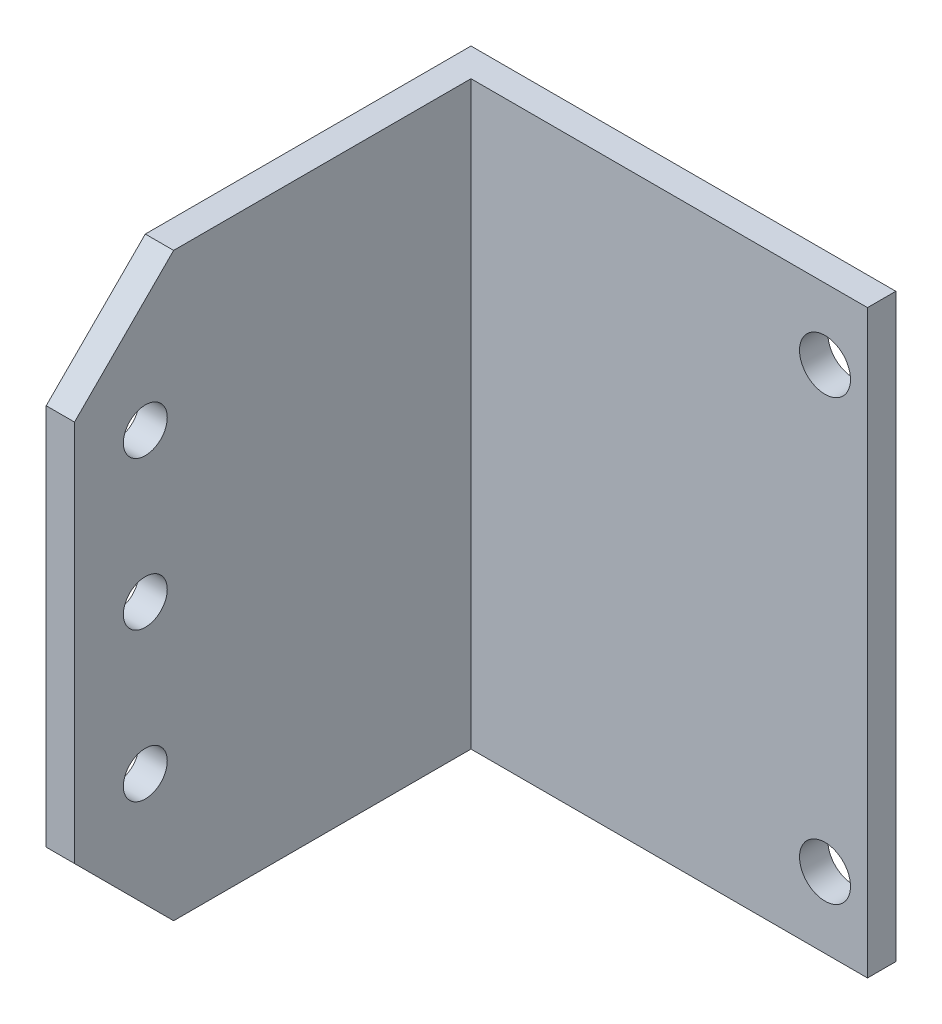
ISO-10303-21;
HEADER;
FILE_DESCRIPTION(('STEP AP214'),'2;1');
FILE_NAME('part.step','',(''),(''),'','','');
FILE_SCHEMA(('AUTOMOTIVE_DESIGN { 1 0 10303 214 1 1 1 1 }'));
ENDSEC;
DATA;
#1=APPLICATION_CONTEXT('core data for automotive mechanical design processes');
#2=APPLICATION_PROTOCOL_DEFINITION('international standard','automotive_design',2000,#1);
#3=PRODUCT_CONTEXT('',#1,'mechanical');
#4=PRODUCT('Part','Part','',(#3));
#5=PRODUCT_RELATED_PRODUCT_CATEGORY('part','',(#4));
#6=PRODUCT_DEFINITION_FORMATION('','',#4);
#7=PRODUCT_DEFINITION_CONTEXT('part definition',#1,'design');
#8=PRODUCT_DEFINITION('design','',#6,#7);
#9=PRODUCT_DEFINITION_SHAPE('','',#8);
#10=(LENGTH_UNIT() NAMED_UNIT(*) SI_UNIT(.MILLI.,.METRE.));
#11=(NAMED_UNIT(*) PLANE_ANGLE_UNIT() SI_UNIT($,.RADIAN.));
#12=(NAMED_UNIT(*) SI_UNIT($,.STERADIAN.) SOLID_ANGLE_UNIT());
#13=UNCERTAINTY_MEASURE_WITH_UNIT(LENGTH_MEASURE(1.E-05),#10,'distance_accuracy_value','');
#14=(GEOMETRIC_REPRESENTATION_CONTEXT(3) GLOBAL_UNCERTAINTY_ASSIGNED_CONTEXT((#13)) GLOBAL_UNIT_ASSIGNED_CONTEXT((#10,
#11,#12)) REPRESENTATION_CONTEXT('',''));
#15=CARTESIAN_POINT('',(0.,0.,0.));
#16=DIRECTION('',(0.,0.,1.));
#17=DIRECTION('',(1.,0.,0.));
#18=AXIS2_PLACEMENT_3D('',#15,#16,#17);
#19=CARTESIAN_POINT('',(0.,0.,2.));
#20=DIRECTION('',(0.,0.,-1.));
#21=DIRECTION('',(-1.,0.,0.));
#22=AXIS2_PLACEMENT_3D('',#19,#20,#21);
#23=PLANE('',#22);
#24=CARTESIAN_POINT('',(-3.,-15.5,2.));
#25=DIRECTION('',(0.,0.,1.));
#26=DIRECTION('',(1.,0.,0.));
#27=AXIS2_PLACEMENT_3D('',#24,#25,#26);
#28=CIRCLE('',#27,1.79999999999998);
#29=CARTESIAN_POINT('',(-1.20000000000001,-15.5,2.));
#30=VERTEX_POINT('',#29);
#31=EDGE_CURVE('E120',#30,#30,#28,.T.);
#32=ORIENTED_EDGE('',*,*,#31,.F.);
#33=EDGE_LOOP('',(#32));
#34=FACE_BOUND('',#33,.T.);
#35=CARTESIAN_POINT('',(-2.99999999999999,15.5,2.));
#36=DIRECTION('',(0.,0.,1.));
#37=DIRECTION('',(1.,0.,0.));
#38=AXIS2_PLACEMENT_3D('',#35,#36,#37);
#39=CIRCLE('',#38,1.79999999999998);
#40=CARTESIAN_POINT('',(-1.20000000000001,15.5,2.));
#41=VERTEX_POINT('',#40);
#42=EDGE_CURVE('E145',#41,#41,#39,.T.);
#43=ORIENTED_EDGE('',*,*,#42,.F.);
#44=EDGE_LOOP('',(#43));
#45=FACE_BOUND('',#44,.T.);
#46=DIRECTION('',(0.,1.,0.));
#47=VECTOR('',#46,1.);
#48=CARTESIAN_POINT('',(-28.,-20.5,2.));
#49=LINE('',#48,#47);
#50=CARTESIAN_POINT('',(-28.,-20.5,2.));
#51=VERTEX_POINT('',#50);
#52=CARTESIAN_POINT('',(-28.,20.5,2.));
#53=VERTEX_POINT('',#52);
#54=EDGE_CURVE('E133',#51,#53,#49,.T.);
#55=ORIENTED_EDGE('',*,*,#54,.F.);
#56=DIRECTION('',(1.,0.,0.));
#57=VECTOR('',#56,1.);
#58=CARTESIAN_POINT('',(0.,-20.5,2.));
#59=LINE('',#58,#57);
#60=CARTESIAN_POINT('',(0.,-20.5,2.));
#61=VERTEX_POINT('',#60);
#62=EDGE_CURVE('E116',#51,#61,#59,.T.);
#63=ORIENTED_EDGE('',*,*,#62,.T.);
#64=DIRECTION('',(0.,1.,0.));
#65=VECTOR('',#64,1.);
#66=CARTESIAN_POINT('',(0.,20.5,2.));
#67=LINE('',#66,#65);
#68=CARTESIAN_POINT('',(0.,20.5,2.));
#69=VERTEX_POINT('',#68);
#70=EDGE_CURVE('E151',#61,#69,#67,.T.);
#71=ORIENTED_EDGE('',*,*,#70,.T.);
#72=DIRECTION('',(-1.,0.,0.));
#73=VECTOR('',#72,1.);
#74=CARTESIAN_POINT('',(0.,20.5,2.));
#75=LINE('',#74,#73);
#76=EDGE_CURVE('E154',#69,#53,#75,.T.);
#77=ORIENTED_EDGE('',*,*,#76,.T.);
#78=EDGE_LOOP('',(#55,#63,#71,#77));
#79=FACE_BOUND('',#78,.T.);
#80=ADVANCED_FACE('F32',(#34,#45,#79),#23,.F.);
#81=CARTESIAN_POINT('',(0.,0.,0.));
#82=DIRECTION('',(0.,0.,-1.));
#83=DIRECTION('',(-1.,0.,0.));
#84=AXIS2_PLACEMENT_3D('',#81,#82,#83);
#85=PLANE('',#84);
#86=CARTESIAN_POINT('',(-2.99999999999999,15.5,0.));
#87=DIRECTION('',(0.,0.,1.));
#88=DIRECTION('',(1.,0.,0.));
#89=AXIS2_PLACEMENT_3D('',#86,#87,#88);
#90=CIRCLE('',#89,1.79999999999998);
#91=CARTESIAN_POINT('',(-1.20000000000001,15.5,0.));
#92=VERTEX_POINT('',#91);
#93=EDGE_CURVE('E143',#92,#92,#90,.T.);
#94=ORIENTED_EDGE('',*,*,#93,.T.);
#95=EDGE_LOOP('',(#94));
#96=FACE_BOUND('',#95,.T.);
#97=DIRECTION('',(0.,1.,0.));
#98=VECTOR('',#97,1.);
#99=CARTESIAN_POINT('',(0.,20.5,0.));
#100=LINE('',#99,#98);
#101=CARTESIAN_POINT('',(0.,-20.5,0.));
#102=VERTEX_POINT('',#101);
#103=CARTESIAN_POINT('',(0.,20.5,0.));
#104=VERTEX_POINT('',#103);
#105=EDGE_CURVE('E148',#102,#104,#100,.T.);
#106=ORIENTED_EDGE('',*,*,#105,.F.);
#107=DIRECTION('',(1.,0.,0.));
#108=VECTOR('',#107,1.);
#109=CARTESIAN_POINT('',(0.,-20.5,0.));
#110=LINE('',#109,#108);
#111=CARTESIAN_POINT('',(-30.,-20.5,0.));
#112=VERTEX_POINT('',#111);
#113=EDGE_CURVE('E155',#112,#102,#110,.T.);
#114=ORIENTED_EDGE('',*,*,#113,.F.);
#115=DIRECTION('',(0.,-1.,0.));
#116=VECTOR('',#115,1.);
#117=CARTESIAN_POINT('',(-30.,20.5,0.));
#118=LINE('',#117,#116);
#119=CARTESIAN_POINT('',(-30.,20.5,0.));
#120=VERTEX_POINT('',#119);
#121=EDGE_CURVE('E171',#120,#112,#118,.T.);
#122=ORIENTED_EDGE('',*,*,#121,.F.);
#123=DIRECTION('',(-1.,0.,0.));
#124=VECTOR('',#123,1.);
#125=CARTESIAN_POINT('',(0.,20.5,0.));
#126=LINE('',#125,#124);
#127=EDGE_CURVE('E174',#104,#120,#126,.T.);
#128=ORIENTED_EDGE('',*,*,#127,.F.);
#129=EDGE_LOOP('',(#106,#114,#122,#128));
#130=FACE_BOUND('',#129,.T.);
#131=CARTESIAN_POINT('',(-3.,-15.5,0.));
#132=DIRECTION('',(0.,0.,1.));
#133=DIRECTION('',(1.,0.,0.));
#134=AXIS2_PLACEMENT_3D('',#131,#132,#133);
#135=CIRCLE('',#134,1.79999999999998);
#136=CARTESIAN_POINT('',(-1.20000000000001,-15.5,0.));
#137=VERTEX_POINT('',#136);
#138=EDGE_CURVE('E117',#137,#137,#135,.T.);
#139=ORIENTED_EDGE('',*,*,#138,.T.);
#140=EDGE_LOOP('',(#139));
#141=FACE_BOUND('',#140,.T.);
#142=ADVANCED_FACE('F183',(#96,#130,#141),#85,.T.);
#143=CARTESIAN_POINT('',(0.,20.5,2.));
#144=DIRECTION('',(-1.,0.,0.));
#145=DIRECTION('',(0.,-1.,0.));
#146=AXIS2_PLACEMENT_3D('',#143,#144,#145);
#147=PLANE('',#146);
#148=ORIENTED_EDGE('',*,*,#105,.T.);
#149=DIRECTION('',(0.,0.,-1.));
#150=VECTOR('',#149,1.);
#151=CARTESIAN_POINT('',(0.,20.5,2.));
#152=LINE('',#151,#150);
#153=EDGE_CURVE('E160',#69,#104,#152,.T.);
#154=ORIENTED_EDGE('',*,*,#153,.F.);
#155=ORIENTED_EDGE('',*,*,#70,.F.);
#156=DIRECTION('',(0.,0.,-1.));
#157=VECTOR('',#156,1.);
#158=CARTESIAN_POINT('',(0.,-20.5,2.));
#159=LINE('',#158,#157);
#160=EDGE_CURVE('E167',#61,#102,#159,.T.);
#161=ORIENTED_EDGE('',*,*,#160,.T.);
#162=EDGE_LOOP('',(#148,#154,#155,#161));
#163=FACE_BOUND('',#162,.T.);
#164=ADVANCED_FACE('F34',(#163),#147,.F.);
#165=CARTESIAN_POINT('',(0.,20.5,2.));
#166=DIRECTION('',(0.,-1.,0.));
#167=DIRECTION('',(0.,0.,-1.));
#168=AXIS2_PLACEMENT_3D('',#165,#166,#167);
#169=PLANE('',#168);
#170=DIRECTION('',(0.,0.,-1.));
#171=VECTOR('',#170,1.);
#172=CARTESIAN_POINT('',(-30.,20.5,2.));
#173=LINE('',#172,#171);
#174=CARTESIAN_POINT('',(-30.,20.5,23.));
#175=VERTEX_POINT('',#174);
#176=EDGE_CURVE('E163',#175,#120,#173,.T.);
#177=ORIENTED_EDGE('',*,*,#176,.F.);
#178=DIRECTION('',(1.,0.,0.));
#179=VECTOR('',#178,1.);
#180=CARTESIAN_POINT('',(-38.,20.5,23.));
#181=LINE('',#180,#179);
#182=CARTESIAN_POINT('',(-28.,20.5,23.));
#183=VERTEX_POINT('',#182);
#184=EDGE_CURVE('E192',#175,#183,#181,.T.);
#185=ORIENTED_EDGE('',*,*,#184,.T.);
#186=DIRECTION('',(0.,0.,-1.));
#187=VECTOR('',#186,1.);
#188=CARTESIAN_POINT('',(-28.,20.5,30.));
#189=LINE('',#188,#187);
#190=EDGE_CURVE('E118',#183,#53,#189,.T.);
#191=ORIENTED_EDGE('',*,*,#190,.T.);
#192=ORIENTED_EDGE('',*,*,#76,.F.);
#193=ORIENTED_EDGE('',*,*,#153,.T.);
#194=ORIENTED_EDGE('',*,*,#127,.T.);
#195=EDGE_LOOP('',(#177,#185,#191,#192,#193,#194));
#196=FACE_BOUND('',#195,.T.);
#197=ADVANCED_FACE('F187',(#196),#169,.F.);
#198=CARTESIAN_POINT('',(-30.,20.5,2.));
#199=DIRECTION('',(1.,0.,0.));
#200=DIRECTION('',(0.,0.,-1.));
#201=AXIS2_PLACEMENT_3D('',#198,#199,#200);
#202=PLANE('',#201);
#203=CARTESIAN_POINT('',(-30.,0.,25.));
#204=DIRECTION('',(1.,0.,0.));
#205=DIRECTION('',(0.,0.,-1.));
#206=AXIS2_PLACEMENT_3D('',#203,#204,#205);
#207=CIRCLE('',#206,1.55);
#208=CARTESIAN_POINT('',(-30.,0.,23.45));
#209=VERTEX_POINT('',#208);
#210=EDGE_CURVE('E208',#209,#209,#207,.T.);
#211=ORIENTED_EDGE('',*,*,#210,.T.);
#212=EDGE_LOOP('',(#211));
#213=FACE_BOUND('',#212,.T.);
#214=CARTESIAN_POINT('',(-30.,-10.5,25.));
#215=DIRECTION('',(1.,0.,0.));
#216=DIRECTION('',(0.,0.,-1.));
#217=AXIS2_PLACEMENT_3D('',#214,#215,#216);
#218=CIRCLE('',#217,1.55);
#219=CARTESIAN_POINT('',(-30.,-10.5,23.45));
#220=VERTEX_POINT('',#219);
#221=EDGE_CURVE('E216',#220,#220,#218,.T.);
#222=ORIENTED_EDGE('',*,*,#221,.T.);
#223=EDGE_LOOP('',(#222));
#224=FACE_BOUND('',#223,.T.);
#225=CARTESIAN_POINT('',(-30.,10.5,25.));
#226=DIRECTION('',(1.,0.,0.));
#227=DIRECTION('',(0.,0.,-1.));
#228=AXIS2_PLACEMENT_3D('',#225,#226,#227);
#229=CIRCLE('',#228,1.55);
#230=CARTESIAN_POINT('',(-30.,10.5,23.45));
#231=VERTEX_POINT('',#230);
#232=EDGE_CURVE('E195',#231,#231,#229,.T.);
#233=ORIENTED_EDGE('',*,*,#232,.T.);
#234=EDGE_LOOP('',(#233));
#235=FACE_BOUND('',#234,.T.);
#236=DIRECTION('',(0.,0.,-1.));
#237=VECTOR('',#236,1.);
#238=CARTESIAN_POINT('',(-30.,-20.5,2.));
#239=LINE('',#238,#237);
#240=CARTESIAN_POINT('',(-30.,-20.5,23.));
#241=VERTEX_POINT('',#240);
#242=EDGE_CURVE('E165',#241,#112,#239,.T.);
#243=ORIENTED_EDGE('',*,*,#242,.F.);
#244=DIRECTION('',(0.,0.707106781186548,0.707106781186548));
#245=VECTOR('',#244,1.);
#246=CARTESIAN_POINT('',(-30.,-10.5,33.));
#247=LINE('',#246,#245);
#248=CARTESIAN_POINT('',(-30.,-13.5,30.));
#249=VERTEX_POINT('',#248);
#250=EDGE_CURVE('E100',#241,#249,#247,.T.);
#251=ORIENTED_EDGE('',*,*,#250,.T.);
#252=DIRECTION('',(0.,-1.,0.));
#253=VECTOR('',#252,1.);
#254=CARTESIAN_POINT('',(-30.,-20.5,30.));
#255=LINE('',#254,#253);
#256=CARTESIAN_POINT('',(-30.,13.5,30.));
#257=VERTEX_POINT('',#256);
#258=EDGE_CURVE('E127',#257,#249,#255,.T.);
#259=ORIENTED_EDGE('',*,*,#258,.F.);
#260=DIRECTION('',(0.,0.707106781186548,-0.707106781186548));
#261=VECTOR('',#260,1.);
#262=CARTESIAN_POINT('',(-30.,31.,12.5));
#263=LINE('',#262,#261);
#264=EDGE_CURVE('E56',#257,#175,#263,.T.);
#265=ORIENTED_EDGE('',*,*,#264,.T.);
#266=ORIENTED_EDGE('',*,*,#176,.T.);
#267=ORIENTED_EDGE('',*,*,#121,.T.);
#268=EDGE_LOOP('',(#243,#251,#259,#265,#266,#267));
#269=FACE_BOUND('',#268,.T.);
#270=ADVANCED_FACE('F190',(#213,#224,#235,#269),#202,.F.);
#271=CARTESIAN_POINT('',(0.,-20.5,2.));
#272=DIRECTION('',(0.,1.,0.));
#273=DIRECTION('',(-1.,0.,0.));
#274=AXIS2_PLACEMENT_3D('',#271,#272,#273);
#275=PLANE('',#274);
#276=DIRECTION('',(0.,0.,-1.));
#277=VECTOR('',#276,1.);
#278=CARTESIAN_POINT('',(-28.,-20.5,30.));
#279=LINE('',#278,#277);
#280=CARTESIAN_POINT('',(-28.,-20.5,23.));
#281=VERTEX_POINT('',#280);
#282=EDGE_CURVE('E36',#281,#51,#279,.T.);
#283=ORIENTED_EDGE('',*,*,#282,.F.);
#284=DIRECTION('',(1.,0.,0.));
#285=VECTOR('',#284,1.);
#286=CARTESIAN_POINT('',(-38.,-20.5,23.));
#287=LINE('',#286,#285);
#288=EDGE_CURVE('E97',#241,#281,#287,.T.);
#289=ORIENTED_EDGE('',*,*,#288,.F.);
#290=ORIENTED_EDGE('',*,*,#242,.T.);
#291=ORIENTED_EDGE('',*,*,#113,.T.);
#292=ORIENTED_EDGE('',*,*,#160,.F.);
#293=ORIENTED_EDGE('',*,*,#62,.F.);
#294=EDGE_LOOP('',(#283,#289,#290,#291,#292,#293));
#295=FACE_BOUND('',#294,.T.);
#296=ADVANCED_FACE('F114',(#295),#275,.F.);
#297=CARTESIAN_POINT('',(-2.99999999999999,15.5,2.));
#298=DIRECTION('',(0.,0.,-1.));
#299=DIRECTION('',(-1.,0.,0.));
#300=AXIS2_PLACEMENT_3D('',#297,#298,#299);
#301=CYLINDRICAL_SURFACE('',#300,1.79999999999998);
#302=ORIENTED_EDGE('',*,*,#42,.T.);
#303=EDGE_LOOP('',(#302));
#304=FACE_BOUND('',#303,.T.);
#305=ORIENTED_EDGE('',*,*,#93,.F.);
#306=EDGE_LOOP('',(#305));
#307=FACE_BOUND('',#306,.T.);
#308=ADVANCED_FACE('F234',(#304,#307),#301,.F.);
#309=CARTESIAN_POINT('',(-3.,-15.5,2.));
#310=DIRECTION('',(0.,0.,-1.));
#311=DIRECTION('',(-1.,0.,0.));
#312=AXIS2_PLACEMENT_3D('',#309,#310,#311);
#313=CYLINDRICAL_SURFACE('',#312,1.79999999999998);
#314=ORIENTED_EDGE('',*,*,#31,.T.);
#315=EDGE_LOOP('',(#314));
#316=FACE_BOUND('',#315,.T.);
#317=ORIENTED_EDGE('',*,*,#138,.F.);
#318=EDGE_LOOP('',(#317));
#319=FACE_BOUND('',#318,.T.);
#320=ADVANCED_FACE('F225',(#316,#319),#313,.F.);
#321=CARTESIAN_POINT('',(-28.,-20.5,30.));
#322=DIRECTION('',(-1.,0.,0.));
#323=DIRECTION('',(0.,0.,1.));
#324=AXIS2_PLACEMENT_3D('',#321,#322,#323);
#325=PLANE('',#324);
#326=CARTESIAN_POINT('',(-28.,0.,25.));
#327=DIRECTION('',(1.,0.,0.));
#328=DIRECTION('',(0.,0.,-1.));
#329=AXIS2_PLACEMENT_3D('',#326,#327,#328);
#330=CIRCLE('',#329,1.55);
#331=CARTESIAN_POINT('',(-28.,0.,23.45));
#332=VERTEX_POINT('',#331);
#333=EDGE_CURVE('E205',#332,#332,#330,.T.);
#334=ORIENTED_EDGE('',*,*,#333,.F.);
#335=EDGE_LOOP('',(#334));
#336=FACE_BOUND('',#335,.T.);
#337=CARTESIAN_POINT('',(-28.,-10.5,25.));
#338=DIRECTION('',(1.,0.,0.));
#339=DIRECTION('',(0.,0.,-1.));
#340=AXIS2_PLACEMENT_3D('',#337,#338,#339);
#341=CIRCLE('',#340,1.55);
#342=CARTESIAN_POINT('',(-28.,-10.5,23.45));
#343=VERTEX_POINT('',#342);
#344=EDGE_CURVE('E213',#343,#343,#341,.T.);
#345=ORIENTED_EDGE('',*,*,#344,.F.);
#346=EDGE_LOOP('',(#345));
#347=FACE_BOUND('',#346,.T.);
#348=CARTESIAN_POINT('',(-28.,10.5,25.));
#349=DIRECTION('',(1.,0.,0.));
#350=DIRECTION('',(0.,0.,-1.));
#351=AXIS2_PLACEMENT_3D('',#348,#349,#350);
#352=CIRCLE('',#351,1.55);
#353=CARTESIAN_POINT('',(-28.,10.5,23.45));
#354=VERTEX_POINT('',#353);
#355=EDGE_CURVE('E198',#354,#354,#352,.T.);
#356=ORIENTED_EDGE('',*,*,#355,.F.);
#357=EDGE_LOOP('',(#356));
#358=FACE_BOUND('',#357,.T.);
#359=DIRECTION('',(0.,1.,0.));
#360=VECTOR('',#359,1.);
#361=CARTESIAN_POINT('',(-28.,-20.5,30.));
#362=LINE('',#361,#360);
#363=CARTESIAN_POINT('',(-28.,-13.5,30.));
#364=VERTEX_POINT('',#363);
#365=CARTESIAN_POINT('',(-28.,13.5,30.));
#366=VERTEX_POINT('',#365);
#367=EDGE_CURVE('E111',#364,#366,#362,.T.);
#368=ORIENTED_EDGE('',*,*,#367,.F.);
#369=DIRECTION('',(0.,0.707106781186547,0.707106781186547));
#370=VECTOR('',#369,1.);
#371=CARTESIAN_POINT('',(-28.,-13.5,30.));
#372=LINE('',#371,#370);
#373=EDGE_CURVE('E49',#281,#364,#372,.T.);
#374=ORIENTED_EDGE('',*,*,#373,.F.);
#375=ORIENTED_EDGE('',*,*,#282,.T.);
#376=ORIENTED_EDGE('',*,*,#54,.T.);
#377=ORIENTED_EDGE('',*,*,#190,.F.);
#378=DIRECTION('',(0.,0.707106781186547,-0.707106781186547));
#379=VECTOR('',#378,1.);
#380=CARTESIAN_POINT('',(-28.,20.5,23.));
#381=LINE('',#380,#379);
#382=EDGE_CURVE('E193',#366,#183,#381,.T.);
#383=ORIENTED_EDGE('',*,*,#382,.F.);
#384=EDGE_LOOP('',(#368,#374,#375,#376,#377,#383));
#385=FACE_BOUND('',#384,.T.);
#386=ADVANCED_FACE('F107',(#336,#347,#358,#385),#325,.F.);
#387=CARTESIAN_POINT('',(0.,0.,30.));
#388=DIRECTION('',(0.,0.,-1.));
#389=DIRECTION('',(-1.,0.,0.));
#390=AXIS2_PLACEMENT_3D('',#387,#388,#389);
#391=PLANE('',#390);
#392=ORIENTED_EDGE('',*,*,#258,.T.);
#393=DIRECTION('',(1.,0.,0.));
#394=VECTOR('',#393,1.);
#395=CARTESIAN_POINT('',(0.,-13.5,30.));
#396=LINE('',#395,#394);
#397=EDGE_CURVE('E11',#249,#364,#396,.T.);
#398=ORIENTED_EDGE('',*,*,#397,.T.);
#399=ORIENTED_EDGE('',*,*,#367,.T.);
#400=DIRECTION('',(-1.,0.,0.));
#401=VECTOR('',#400,1.);
#402=CARTESIAN_POINT('',(0.,13.5,30.));
#403=LINE('',#402,#401);
#404=EDGE_CURVE('E42',#366,#257,#403,.T.);
#405=ORIENTED_EDGE('',*,*,#404,.T.);
#406=EDGE_LOOP('',(#392,#398,#399,#405));
#407=FACE_BOUND('',#406,.T.);
#408=ADVANCED_FACE('F204',(#407),#391,.F.);
#409=CARTESIAN_POINT('',(-38.,20.5,23.));
#410=DIRECTION('',(0.,-0.707106781186548,-0.707106781186548));
#411=DIRECTION('',(0.,0.707106781186548,-0.707106781186548));
#412=AXIS2_PLACEMENT_3D('',#409,#410,#411);
#413=PLANE('',#412);
#414=ORIENTED_EDGE('',*,*,#404,.F.);
#415=ORIENTED_EDGE('',*,*,#382,.T.);
#416=ORIENTED_EDGE('',*,*,#184,.F.);
#417=ORIENTED_EDGE('',*,*,#264,.F.);
#418=EDGE_LOOP('',(#414,#415,#416,#417));
#419=FACE_BOUND('',#418,.T.);
#420=ADVANCED_FACE('F232',(#419),#413,.F.);
#421=CARTESIAN_POINT('',(-38.,10.5,25.));
#422=DIRECTION('',(1.,0.,0.));
#423=DIRECTION('',(0.,0.,-1.));
#424=AXIS2_PLACEMENT_3D('',#421,#422,#423);
#425=CYLINDRICAL_SURFACE('',#424,1.55);
#426=ORIENTED_EDGE('',*,*,#355,.T.);
#427=EDGE_LOOP('',(#426));
#428=FACE_BOUND('',#427,.T.);
#429=ORIENTED_EDGE('',*,*,#232,.F.);
#430=EDGE_LOOP('',(#429));
#431=FACE_BOUND('',#430,.T.);
#432=ADVANCED_FACE('F221',(#428,#431),#425,.F.);
#433=CARTESIAN_POINT('',(-38.,-10.5,25.));
#434=DIRECTION('',(1.,0.,0.));
#435=DIRECTION('',(0.,0.,-1.));
#436=AXIS2_PLACEMENT_3D('',#433,#434,#435);
#437=CYLINDRICAL_SURFACE('',#436,1.55);
#438=ORIENTED_EDGE('',*,*,#344,.T.);
#439=EDGE_LOOP('',(#438));
#440=FACE_BOUND('',#439,.T.);
#441=ORIENTED_EDGE('',*,*,#221,.F.);
#442=EDGE_LOOP('',(#441));
#443=FACE_BOUND('',#442,.T.);
#444=ADVANCED_FACE('F335',(#440,#443),#437,.F.);
#445=CARTESIAN_POINT('',(-38.,0.,25.));
#446=DIRECTION('',(1.,0.,0.));
#447=DIRECTION('',(0.,0.,-1.));
#448=AXIS2_PLACEMENT_3D('',#445,#446,#447);
#449=CYLINDRICAL_SURFACE('',#448,1.55);
#450=ORIENTED_EDGE('',*,*,#333,.T.);
#451=EDGE_LOOP('',(#450));
#452=FACE_BOUND('',#451,.T.);
#453=ORIENTED_EDGE('',*,*,#210,.F.);
#454=EDGE_LOOP('',(#453));
#455=FACE_BOUND('',#454,.T.);
#456=ADVANCED_FACE('F344',(#452,#455),#449,.F.);
#457=CARTESIAN_POINT('',(-38.,-13.5,30.));
#458=DIRECTION('',(0.,0.707106781186548,-0.707106781186548));
#459=DIRECTION('',(0.,0.707106781186548,0.707106781186548));
#460=AXIS2_PLACEMENT_3D('',#457,#458,#459);
#461=PLANE('',#460);
#462=ORIENTED_EDGE('',*,*,#288,.T.);
#463=ORIENTED_EDGE('',*,*,#373,.T.);
#464=ORIENTED_EDGE('',*,*,#397,.F.);
#465=ORIENTED_EDGE('',*,*,#250,.F.);
#466=EDGE_LOOP('',(#462,#463,#464,#465));
#467=FACE_BOUND('',#466,.T.);
#468=ADVANCED_FACE('F98',(#467),#461,.F.);
#469=CLOSED_SHELL('',(#80,#142,#164,#197,#270,#296,#308,#320,#386,#408,#420,#432,#444,#456,#468));
#470=MANIFOLD_SOLID_BREP('B2',#469);
#471=ADVANCED_BREP_SHAPE_REPRESENTATION('',(#18,#470),#14);
#472=SHAPE_DEFINITION_REPRESENTATION(#9,#471);
ENDSEC;
END-ISO-10303-21;
